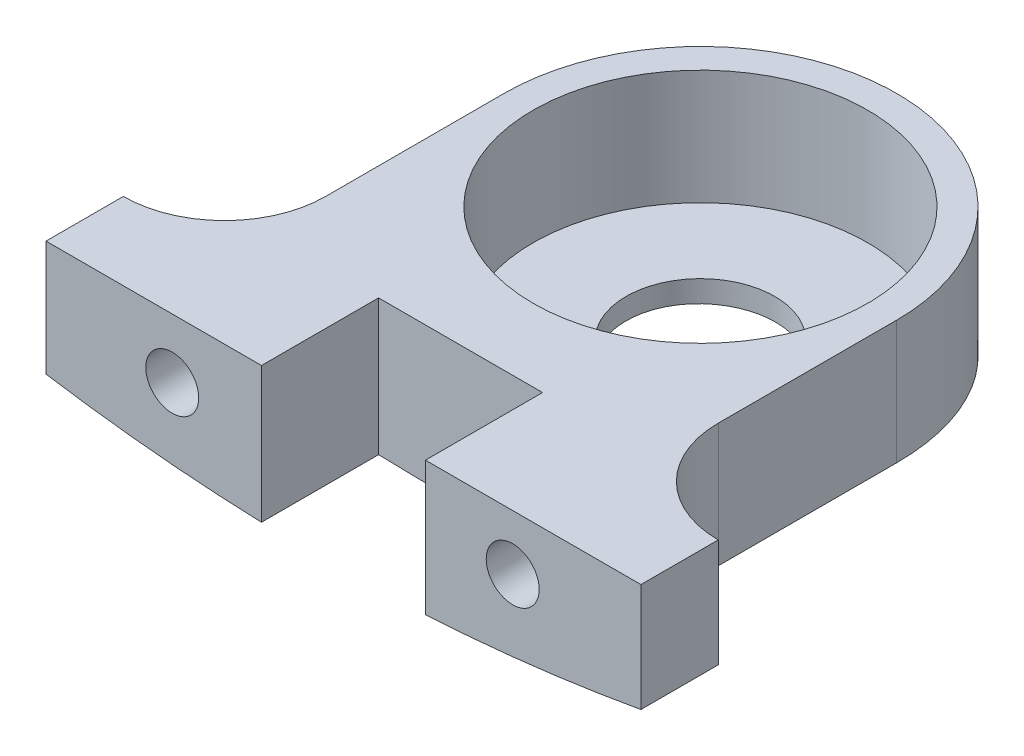
ISO-10303-21;
HEADER;
FILE_DESCRIPTION(('STEP AP214'),'2;1');
FILE_NAME('part.step','',(''),(''),'','','');
FILE_SCHEMA(('AUTOMOTIVE_DESIGN { 1 0 10303 214 1 1 1 1 }'));
ENDSEC;
DATA;
#1=APPLICATION_CONTEXT('core data for automotive mechanical design processes');
#2=APPLICATION_PROTOCOL_DEFINITION('international standard','automotive_design',2000,#1);
#3=PRODUCT_CONTEXT('',#1,'mechanical');
#4=PRODUCT('Part','Part','',(#3));
#5=PRODUCT_RELATED_PRODUCT_CATEGORY('part','',(#4));
#6=PRODUCT_DEFINITION_FORMATION('','',#4);
#7=PRODUCT_DEFINITION_CONTEXT('part definition',#1,'design');
#8=PRODUCT_DEFINITION('design','',#6,#7);
#9=PRODUCT_DEFINITION_SHAPE('','',#8);
#10=(LENGTH_UNIT() NAMED_UNIT(*) SI_UNIT(.MILLI.,.METRE.));
#11=(NAMED_UNIT(*) PLANE_ANGLE_UNIT() SI_UNIT($,.RADIAN.));
#12=(NAMED_UNIT(*) SI_UNIT($,.STERADIAN.) SOLID_ANGLE_UNIT());
#13=UNCERTAINTY_MEASURE_WITH_UNIT(LENGTH_MEASURE(1.E-05),#10,'distance_accuracy_value','');
#14=(GEOMETRIC_REPRESENTATION_CONTEXT(3) GLOBAL_UNCERTAINTY_ASSIGNED_CONTEXT((#13)) GLOBAL_UNIT_ASSIGNED_CONTEXT((#10,
#11,#12)) REPRESENTATION_CONTEXT('',''));
#15=CARTESIAN_POINT('',(0.,0.,0.));
#16=DIRECTION('',(0.,0.,1.));
#17=DIRECTION('',(1.,0.,0.));
#18=AXIS2_PLACEMENT_3D('',#15,#16,#17);
#19=CARTESIAN_POINT('',(0.,5.842,0.));
#20=DIRECTION('',(0.,0.,-1.));
#21=DIRECTION('',(-1.,0.,0.));
#22=AXIS2_PLACEMENT_3D('',#19,#20,#21);
#23=PLANE('',#22);
#24=CARTESIAN_POINT('',(5.390000015,3.302,0.));
#25=DIRECTION('',(0.,0.,1.));
#26=DIRECTION('',(1.,0.,0.));
#27=AXIS2_PLACEMENT_3D('',#24,#25,#26);
#28=CIRCLE('',#27,1.1303);
#29=CARTESIAN_POINT('',(6.520300015,3.302,0.));
#30=VERTEX_POINT('',#29);
#31=EDGE_CURVE('E392',#30,#30,#28,.T.);
#32=ORIENTED_EDGE('',*,*,#31,.F.);
#33=EDGE_LOOP('',(#32));
#34=FACE_BOUND('',#33,.T.);
#35=CARTESIAN_POINT('',(11.811,76.2,0.));
#36=DIRECTION('',(0.,0.,1.));
#37=DIRECTION('',(1.,0.,0.));
#38=AXIS2_PLACEMENT_3D('',#35,#36,#37);
#39=CIRCLE('',#38,76.2);
#40=CARTESIAN_POINT('',(0.,0.920917387364509,0.));
#41=VERTEX_POINT('',#40);
#42=CARTESIAN_POINT('',(9.200000015,0.0447462148649436,0.));
#43=VERTEX_POINT('',#42);
#44=EDGE_CURVE('E171',#41,#43,#39,.T.);
#45=ORIENTED_EDGE('',*,*,#44,.T.);
#46=DIRECTION('',(0.,1.,0.));
#47=VECTOR('',#46,1.);
#48=CARTESIAN_POINT('',(9.200000015,0.,0.));
#49=LINE('',#48,#47);
#50=CARTESIAN_POINT('',(9.200000015,5.842,0.));
#51=VERTEX_POINT('',#50);
#52=EDGE_CURVE('E154',#43,#51,#49,.T.);
#53=ORIENTED_EDGE('',*,*,#52,.T.);
#54=DIRECTION('',(1.,0.,0.));
#55=VECTOR('',#54,1.);
#56=CARTESIAN_POINT('',(0.,5.842,0.));
#57=LINE('',#56,#55);
#58=CARTESIAN_POINT('',(0.,5.842,0.));
#59=VERTEX_POINT('',#58);
#60=EDGE_CURVE('E169',#59,#51,#57,.T.);
#61=ORIENTED_EDGE('',*,*,#60,.F.);
#62=DIRECTION('',(0.,-1.,0.));
#63=VECTOR('',#62,1.);
#64=CARTESIAN_POINT('',(0.,5.842,0.));
#65=LINE('',#64,#63);
#66=EDGE_CURVE('E190',#59,#41,#65,.T.);
#67=ORIENTED_EDGE('',*,*,#66,.T.);
#68=EDGE_LOOP('',(#45,#53,#61,#67));
#69=FACE_BOUND('',#68,.T.);
#70=ADVANCED_FACE('F63',(#34,#69),#23,.F.);
#71=CARTESIAN_POINT('',(12.7,0.,-15.24));
#72=DIRECTION('',(0.,1.,0.));
#73=DIRECTION('',(0.,0.,1.));
#74=AXIS2_PLACEMENT_3D('',#71,#72,#73);
#75=CYLINDRICAL_SURFACE('',#74,3.175);
#76=CARTESIAN_POINT('',(12.7,0.9398,-15.24));
#77=DIRECTION('',(0.,1.,0.));
#78=DIRECTION('',(0.,0.,1.));
#79=AXIS2_PLACEMENT_3D('',#76,#77,#78);
#80=CIRCLE('',#79,3.175);
#81=CARTESIAN_POINT('',(12.7,0.9398,-12.065));
#82=VERTEX_POINT('',#81);
#83=EDGE_CURVE('E193',#82,#82,#80,.F.);
#84=ORIENTED_EDGE('',*,*,#83,.F.);
#85=EDGE_LOOP('',(#84));
#86=FACE_BOUND('',#85,.T.);
#87=CARTESIAN_POINT('',(11.811,0.,-18.288));
#88=CARTESIAN_POINT('',(11.639659984955,-1.33020330484414E-07,-18.2380258069107));
#89=CARTESIAN_POINT('',(11.4725436808237,0.000582784709653354,-18.1735694069715));
#90=CARTESIAN_POINT('',(11.1515045205025,0.00268466430180102,-18.017524324657));
#91=CARTESIAN_POINT('',(10.9975817708532,0.00420363372195491,-17.9259354232079));
#92=CARTESIAN_POINT('',(10.7073005094617,0.00785504660870994,-17.7182300502918));
#93=CARTESIAN_POINT('',(10.5709415435385,0.00998747420731721,-17.6021142132704));
#94=CARTESIAN_POINT('',(10.3196471262968,0.0144915515595443,-17.3486474058928));
#95=CARTESIAN_POINT('',(10.2047116686422,0.0168632012424116,-17.2112964418172));
#96=CARTESIAN_POINT('',(9.99948257465703,0.0214664093906249,-16.9191970238617));
#97=CARTESIAN_POINT('',(9.90919815358528,0.0236979152268404,-16.7644420943244));
#98=CARTESIAN_POINT('',(9.75589103243003,0.0276793248309426,-16.4419654239387));
#99=CARTESIAN_POINT('',(9.69286834897078,0.0294292283051472,-16.2742436751832));
#100=CARTESIAN_POINT('',(9.59588152829753,0.0321877444029808,-15.9306105035032));
#101=CARTESIAN_POINT('',(9.56191455798182,0.0331964292983974,-15.7546998808058));
#102=CARTESIAN_POINT('',(9.52399600497441,0.0343254425543746,-15.3996698849849));
#103=CARTESIAN_POINT('',(9.52004440144702,0.0344457715316032,-15.2205505140891));
#104=CARTESIAN_POINT('',(9.54226473207113,0.0337807233790837,-14.8642603093596));
#105=CARTESIAN_POINT('',(9.56842526119745,0.0329956891570814,-14.687088763435));
#106=CARTESIAN_POINT('',(9.6501055117808,0.0306348554942418,-14.3396603306782));
#107=CARTESIAN_POINT('',(9.70562413703261,0.029059085578885,-14.169403185924));
#108=CARTESIAN_POINT('',(9.84444010554728,0.0253491200150155,-13.8406268478551));
#109=CARTESIAN_POINT('',(9.92773724962378,0.0232149283706997,-13.6821075703839));
#110=CARTESIAN_POINT('',(10.1197766169972,0.0187099693643392,-13.3812578001234));
#111=CARTESIAN_POINT('',(10.2285251208648,0.0163391436916409,-13.2389313160947));
#112=CARTESIAN_POINT('',(10.4684575073065,0.0117334111774266,-12.9744391418341));
#113=CARTESIAN_POINT('',(10.5996609112935,0.00949862491456395,-12.8522911771513));
#114=CARTESIAN_POINT('',(10.8806251602909,0.00555112808064739,-12.6318762751439));
#115=CARTESIAN_POINT('',(11.030363844734,0.00383780237804544,-12.5335812281293));
#116=CARTESIAN_POINT('',(11.2862239850511,0.00174239189259228,-12.3949011161598));
#117=CARTESIAN_POINT('',(11.3880971980375,0.00110241373054494,-12.3465212823384));
#118=CARTESIAN_POINT('',(11.5964030074975,0.000230945059182641,-12.2608421085277));
#119=CARTESIAN_POINT('',(11.7028356044303,-5.45409004557044E-07,-12.2235427696539));
#120=CARTESIAN_POINT('',(11.9821016494661,8.62764336378542E-07,-12.1421035448117));
#121=CARTESIAN_POINT('',(12.157536782265,0.000582349386991219,-12.1066117647604));
#122=CARTESIAN_POINT('',(12.5120096053791,0.00301793360574082,-12.0655409285875));
#123=CARTESIAN_POINT('',(12.6910512994351,0.00487353087665019,-12.0599971906667));
#124=CARTESIAN_POINT('',(13.0474375237304,0.00982378188205822,-12.0790308540357));
#125=CARTESIAN_POINT('',(13.224782838651,0.0129178312460224,-12.103593575269));
#126=CARTESIAN_POINT('',(13.5727716448817,0.0201702301276907,-12.1821073146812));
#127=CARTESIAN_POINT('',(13.7434167260534,0.0243283253818394,-12.2360513154032));
#128=CARTESIAN_POINT('',(14.0733180294454,0.0334116140343461,-12.3718201838417));
#129=CARTESIAN_POINT('',(14.2325679502216,0.0383372271535053,-12.4536603359546));
#130=CARTESIAN_POINT('',(14.535077304713,0.0485565247861523,-12.6428960229309));
#131=CARTESIAN_POINT('',(14.6783360284313,0.0538502256255328,-12.7502926918218));
#132=CARTESIAN_POINT('',(14.9449267883802,0.0643555746529418,-12.9877086572589));
#133=CARTESIAN_POINT('',(15.0682407214338,0.069567144464644,-13.117748286203));
#134=CARTESIAN_POINT('',(15.2912874442229,0.079437081313316,-13.396702524333));
#135=CARTESIAN_POINT('',(15.391020279945,0.0840954494291022,-13.5456170967091));
#136=CARTESIAN_POINT('',(15.5640592150125,0.0924308511637478,-13.8580877605781));
#137=CARTESIAN_POINT('',(15.637367955143,0.0961079828363858,-14.0216423869252));
#138=CARTESIAN_POINT('',(15.7554778418362,0.102137902287413,-14.3587625917334));
#139=CARTESIAN_POINT('',(15.8002792657872,0.104490702952075,-14.5323280727668));
#140=CARTESIAN_POINT('',(15.8600550613065,0.107647819146207,-14.884321487261));
#141=CARTESIAN_POINT('',(15.8750650051274,0.108453981387101,-15.0627433634955));
#142=CARTESIAN_POINT('',(15.8749345714229,0.108447013058018,-15.4195756476724));
#143=CARTESIAN_POINT('',(15.8597943249342,0.107633889525673,-15.5979860556614));
#144=CARTESIAN_POINT('',(15.7998211859722,0.104466667319048,-15.9495876766059));
#145=CARTESIAN_POINT('',(15.7550111509592,0.102113754906836,-16.1227828000906));
#146=CARTESIAN_POINT('',(15.6370011068179,0.0960895751541482,-16.4591898692493));
#147=CARTESIAN_POINT('',(15.5638009914253,0.0924183028790484,-16.6224017775535));
#148=CARTESIAN_POINT('',(15.391033903657,0.0840962148865524,-16.9343350170851));
#149=CARTESIAN_POINT('',(15.2914488798053,0.079444728994602,-17.0830463319446));
#150=CARTESIAN_POINT('',(15.0687600818987,0.069589625409996,-17.3616512676511));
#151=CARTESIAN_POINT('',(14.9456561227703,0.0643860033726521,-17.4915447404037));
#152=CARTESIAN_POINT('',(14.6792476870334,0.0538844760347486,-17.7289919216759));
#153=CARTESIAN_POINT('',(14.5359187264652,0.0485864633612083,-17.8365181566684));
#154=CARTESIAN_POINT('',(14.2332315855067,0.0383581419059909,-18.0259836942686));
#155=CARTESIAN_POINT('',(14.0738733695013,0.0334278339413563,-18.1079229400232));
#156=CARTESIAN_POINT('',(13.7436081709901,0.0243326701342399,-18.2438981576036));
#157=CARTESIAN_POINT('',(13.5726988997707,0.0201679665994959,-18.2979285811679));
#158=CARTESIAN_POINT('',(13.2242121143629,0.0129066852294593,-18.3765156730495));
#159=CARTESIAN_POINT('',(13.0466346710745,0.00981009604089902,-18.4010726546546));
#160=CARTESIAN_POINT('',(12.6902814769103,0.00486538129947752,-18.4199830684824));
#161=CARTESIAN_POINT('',(12.5115095257409,0.00301433712999111,-18.4144073880049));
#162=CARTESIAN_POINT('',(12.1574210199326,0.000581714374151783,-18.3733685633865));
#163=CARTESIAN_POINT('',(11.9821044572641,1.32837482236829E-07,-18.3379054887062));
#164=CARTESIAN_POINT('',(11.811,0.,-18.288));
#165=B_SPLINE_CURVE_WITH_KNOTS('',3,(#87,#88,#89,#90,#91,#92,#93,#94,#95,#96,#97,#98,#99,#100,
#101,#102,#103,#104,#105,#106,#107,#108,#109,#110,#111,#112,#113,#114,#115,#116,#117,#118,#119,
#120,#121,#122,#123,#124,#125,#126,#127,#128,#129,#130,#131,#132,#133,#134,#135,#136,#137,#138,
#139,#140,#141,#142,#143,#144,#145,#146,#147,#148,#149,#150,#151,#152,#153,#154,#155,#156,#157,
#158,#159,#160,#161,#162,#163,#164),.UNSPECIFIED.,.T.,.F.,(4,2,2,2,2,2,2,2,2,2,2,2,2,2,2,2,2,2,
2,2,2,2,2,2,2,2,2,2,2,2,2,2,2,2,2,2,2,2,4),(0.,0.534805626423452,1.0696155711005,
1.60441168337902,2.13920763748625,2.67420324065991,3.20919917007418,3.74414292831305,
4.27908631521123,4.81382715797578,5.34854803540201,5.88326507868484,6.41811421218935,
6.95343070675916,7.48811325527528,7.82586275326964,8.16361228526964,8.69788700411056,
9.23279166426802,9.76743560603119,10.3019519088131,10.8367615469085,11.3715949207076,
11.9069110520126,12.4422261393633,12.9774877132715,13.5127440787793,14.0473609407554,
14.5819754792208,15.1161786317228,15.6503837837694,16.1849553651592,16.7195311533359,
17.2547597299094,17.7899894957293,18.3253256240793,18.8606560620257,19.3947276803663,
19.9287980574871),.UNSPECIFIED.);
#166=CARTESIAN_POINT('',(11.811,0.,-18.288));
#167=VERTEX_POINT('',#166);
#168=EDGE_CURVE('E233',#167,#167,#165,.T.);
#169=ORIENTED_EDGE('',*,*,#168,.F.);
#170=EDGE_LOOP('',(#169));
#171=FACE_BOUND('',#170,.T.);
#172=ADVANCED_FACE('F259',(#86,#171),#75,.F.);
#173=CARTESIAN_POINT('',(19.9258568558448,3.48724958219015,0.));
#174=DIRECTION('',(0.,0.,1.));
#175=DIRECTION('',(-1.,0.,0.));
#176=AXIS2_PLACEMENT_3D('',#173,#174,#175);
#177=CIRCLE('',#176,1.1303);
#178=CARTESIAN_POINT('',(18.7955568558448,3.48724958219015,0.));
#179=VERTEX_POINT('',#178);
#180=EDGE_CURVE('E274',#179,#179,#177,.T.);
#181=ORIENTED_EDGE('',*,*,#180,.F.);
#182=EDGE_LOOP('',(#181));
#183=FACE_BOUND('',#182,.T.);
#184=CARTESIAN_POINT('',(16.200000015,5.842,0.));
#185=VERTEX_POINT('',#184);
#186=CARTESIAN_POINT('',(25.4,5.842,0.));
#187=VERTEX_POINT('',#186);
#188=EDGE_CURVE('E180',#185,#187,#57,.T.);
#189=ORIENTED_EDGE('',*,*,#188,.F.);
#190=DIRECTION('',(0.,1.,0.));
#191=VECTOR('',#190,1.);
#192=CARTESIAN_POINT('',(16.200000015,0.,0.));
#193=LINE('',#192,#191);
#194=CARTESIAN_POINT('',(16.200000015,0.126504754491996,0.));
#195=VERTEX_POINT('',#194);
#196=EDGE_CURVE('E172',#195,#185,#193,.T.);
#197=ORIENTED_EDGE('',*,*,#196,.F.);
#198=CARTESIAN_POINT('',(25.4,1.22147588142323,0.));
#199=VERTEX_POINT('',#198);
#200=EDGE_CURVE('E294',#195,#199,#39,.T.);
#201=ORIENTED_EDGE('',*,*,#200,.T.);
#202=DIRECTION('',(0.,-1.,0.));
#203=VECTOR('',#202,1.);
#204=CARTESIAN_POINT('',(25.4,5.842,0.));
#205=LINE('',#204,#203);
#206=EDGE_CURVE('E183',#187,#199,#205,.T.);
#207=ORIENTED_EDGE('',*,*,#206,.F.);
#208=EDGE_LOOP('',(#189,#197,#201,#207));
#209=FACE_BOUND('',#208,.T.);
#210=ADVANCED_FACE('F244',(#183,#209),#23,.F.);
#211=CARTESIAN_POINT('',(12.7,0.,-15.24));
#212=DIRECTION('',(0.,1.,0.));
#213=DIRECTION('',(0.,0.,1.));
#214=AXIS2_PLACEMENT_3D('',#211,#212,#213);
#215=CYLINDRICAL_SURFACE('',#214,8.382);
#216=DIRECTION('',(0.,1.,0.));
#217=VECTOR('',#216,1.);
#218=CARTESIAN_POINT('',(21.082,0.,-15.24));
#219=LINE('',#218,#217);
#220=CARTESIAN_POINT('',(21.082,0.566088564718556,-15.24));
#221=VERTEX_POINT('',#220);
#222=CARTESIAN_POINT('',(21.082,5.842,-15.24));
#223=VERTEX_POINT('',#222);
#224=EDGE_CURVE('E341',#221,#223,#219,.T.);
#225=ORIENTED_EDGE('',*,*,#224,.F.);
#226=CARTESIAN_POINT('',(21.082,0.566088564718556,-15.24));
#227=CARTESIAN_POINT('',(21.0820263058052,0.566100067666238,-15.4747887029446));
#228=CARTESIAN_POINT('',(21.0721361014276,0.564879731263794,-15.7095725206864));
#229=CARTESIAN_POINT('',(21.0327135207659,0.560058642797299,-16.177443867934));
#230=CARTESIAN_POINT('',(21.0031826038017,0.556458067586919,-16.4105315221653));
#231=CARTESIAN_POINT('',(20.9247086755802,0.546964493741107,-16.8731278451367));
#232=CARTESIAN_POINT('',(20.8757851183609,0.541073792595658,-17.102639861759));
#233=CARTESIAN_POINT('',(20.7588958527304,0.527160459911592,-17.5566937893149));
#234=CARTESIAN_POINT('',(20.6909302694616,0.519137842383745,-17.7812357329009));
#235=CARTESIAN_POINT('',(20.5364406918093,0.501170939433018,-18.2238004168814));
#236=CARTESIAN_POINT('',(20.4499138548274,0.491226359690717,-18.4418221528926));
#237=CARTESIAN_POINT('',(20.258900482068,0.469674409561355,-18.8698613589363));
#238=CARTESIAN_POINT('',(20.1544073162543,0.458066425599808,-19.0798758390064));
#239=CARTESIAN_POINT('',(19.9282656802866,0.433497358767446,-19.4902916302789));
#240=CARTESIAN_POINT('',(19.8066222314208,0.420536672230578,-19.69069573229));
#241=CARTESIAN_POINT('',(19.5470166414081,0.393594796485769,-20.0805721148191));
#242=CARTESIAN_POINT('',(19.4090541518485,0.379613585492006,-20.2700441618083));
#243=CARTESIAN_POINT('',(19.1171179493646,0.350924576115074,-20.6375779591886));
#244=CARTESIAN_POINT('',(18.9630743420993,0.336213765290174,-20.8155839596788));
#245=CARTESIAN_POINT('',(18.6405760704325,0.306501560324867,-21.1580061064741));
#246=CARTESIAN_POINT('',(18.4721210220939,0.29150015845103,-21.322421890491));
#247=CARTESIAN_POINT('',(18.1219825771435,0.26158835431106,-21.6365099792514));
#248=CARTESIAN_POINT('',(17.9402993956972,0.246677950569047,-21.7861825237117));
#249=CARTESIAN_POINT('',(17.5649031847573,0.217317440803927,-22.0697876023989));
#250=CARTESIAN_POINT('',(17.3711860196069,0.202867495634334,-22.2037146792125));
#251=CARTESIAN_POINT('',(16.9724196145921,0.174742136785004,-22.4552702970739));
#252=CARTESIAN_POINT('',(16.7673324873607,0.161069663594421,-22.5728391175199));
#253=CARTESIAN_POINT('',(16.3479000075055,0.134891807505808,-22.7902682042113));
#254=CARTESIAN_POINT('',(16.1335544940412,0.122386444895256,-22.8901281626568));
#255=CARTESIAN_POINT('',(15.6971589359485,0.0988468893636747,-23.0713969812919));
#256=CARTESIAN_POINT('',(15.4751100859635,0.0878124696008702,-23.1528086878411));
#257=CARTESIAN_POINT('',(15.0248535399748,0.0674713121985227,-23.2966016648958));
#258=CARTESIAN_POINT('',(14.7966458261651,0.058164579554535,-23.3589828803755));
#259=CARTESIAN_POINT('',(14.3410155385146,0.0416794528068576,-23.4630369765526));
#260=CARTESIAN_POINT('',(14.1136957198279,0.034457014166213,-23.505153317289));
#261=CARTESIAN_POINT('',(13.6563017091499,0.0220031906409708,-23.570472859107));
#262=CARTESIAN_POINT('',(13.4262275495711,0.0167717823501695,-23.5936762825292));
#263=CARTESIAN_POINT('',(12.9649092202769,0.00838816342466078,-23.6209986143273));
#264=CARTESIAN_POINT('',(12.7336650421773,0.00523596771075743,-23.6251173857496));
#265=CARTESIAN_POINT('',(12.2716097549251,0.00104188194711074,-23.6142348694598));
#266=CARTESIAN_POINT('',(12.0407986438003,-1.77363193689054E-08,-23.5992336690324));
#267=CARTESIAN_POINT('',(11.5773215628072,1.80357975798893E-08,-23.5497979635059));
#268=CARTESIAN_POINT('',(11.3446900694219,0.00107743280735119,-23.5150396333272));
#269=CARTESIAN_POINT('',(10.8831917284888,0.00529922802862396,-23.4261074139461));
#270=CARTESIAN_POINT('',(10.6543248377899,0.00844358476947923,-23.3719337474507));
#271=CARTESIAN_POINT('',(10.2019276037295,0.016654805823008,-23.2445483390511));
#272=CARTESIAN_POINT('',(9.97839857086911,0.0217221371919518,-23.1713319733749));
#273=CARTESIAN_POINT('',(9.53839824789873,0.0335788843295557,-23.0064263485847));
#274=CARTESIAN_POINT('',(9.32192453991092,0.0403677029857307,-22.9147434969915));
#275=CARTESIAN_POINT('',(8.89748659436005,0.0554234466098431,-22.7135514414295));
#276=CARTESIAN_POINT('',(8.68952215503927,0.0636903365072111,-22.6040426604265));
#277=CARTESIAN_POINT('',(8.28356230582336,0.0814183721008371,-22.3679824049762));
#278=CARTESIAN_POINT('',(8.08556667978855,0.0908794918886874,-22.2414313002522));
#279=CARTESIAN_POINT('',(7.70092687021768,0.110681492407803,-21.9721840189543));
#280=CARTESIAN_POINT('',(7.51428252915107,0.121022360925336,-21.8294880665135));
#281=CARTESIAN_POINT('',(7.15364642646395,0.142247650103028,-21.5289569909565));
#282=CARTESIAN_POINT('',(6.97965450938053,0.153132064081761,-21.3711220539114));
#283=CARTESIAN_POINT('',(6.64493798282821,0.175135376792775,-21.0408297864461));
#284=CARTESIAN_POINT('',(6.48426279931456,0.186254972229576,-20.8683224106588));
#285=CARTESIAN_POINT('',(6.17805625805771,0.208332645065771,-20.5104472543179));
#286=CARTESIAN_POINT('',(6.03251971922792,0.219290776615554,-20.3250839100629));
#287=CARTESIAN_POINT('',(5.75748792770342,0.240708048671227,-19.9426535282725));
#288=CARTESIAN_POINT('',(5.6280003619961,0.251166948596452,-19.7455809486977));
#289=CARTESIAN_POINT('',(5.38607074330337,0.271250344187324,-19.3412039235228));
#290=CARTESIAN_POINT('',(5.27362819059503,0.28087486431164,-19.1338997781265));
#291=CARTESIAN_POINT('',(5.06640886760331,0.299003081763044,-18.7101488609645));
#292=CARTESIAN_POINT('',(4.9716630358459,0.307504808692184,-18.4936868741408));
#293=CARTESIAN_POINT('',(4.80076625048308,0.323099755140285,-18.0534977768605));
#294=CARTESIAN_POINT('',(4.72461485097727,0.33019300843413,-17.8297708407655));
#295=CARTESIAN_POINT('',(4.59153974770292,0.342740232371341,-17.3769207267459));
#296=CARTESIAN_POINT('',(4.53459314667036,0.348196154291027,-17.1478043258225));
#297=CARTESIAN_POINT('',(4.44024011226366,0.357306560988338,-16.6856407015562));
#298=CARTESIAN_POINT('',(4.40282447227246,0.360961894491853,-16.452595383827));
#299=CARTESIAN_POINT('',(4.3562042144541,0.365532984157617,-16.0559448153203));
#300=CARTESIAN_POINT('',(4.34186920042574,0.366944900703798,-15.8929299323694));
#301=CARTESIAN_POINT('',(4.32277339316055,0.368829060226534,-15.5666151214052));
#302=CARTESIAN_POINT('',(4.31799625101577,0.369302907771964,-15.4033161591638));
#303=CARTESIAN_POINT('',(4.318,0.369300735124452,-15.24));
#304=B_SPLINE_CURVE_WITH_KNOTS('',3,(#226,#227,#228,#229,#230,#231,#232,#233,#234,#235,#236,
#237,#238,#239,#240,#241,#242,#243,#244,#245,#246,#247,#248,#249,#250,#251,#252,#253,#254,#255,
#256,#257,#258,#259,#260,#261,#262,#263,#264,#265,#266,#267,#268,#269,#270,#271,#272,#273,#274,
#275,#276,#277,#278,#279,#280,#281,#282,#283,#284,#285,#286,#287,#288,#289,#290,#291,#292,#293,
#294,#295,#296,#297,#298,#299,#300,#301,#302,#303),.UNSPECIFIED.,.F.,.F.,(4,2,2,2,2,2,2,2,2,2,2,
2,2,2,2,2,2,2,2,2,2,2,2,2,2,2,2,2,2,2,2,2,2,2,2,2,2,2,4),(0.,0.704147599851042,1.40824288684472,
2.11163362969969,2.81501975004654,3.51851366879976,4.22226775424248,4.92581621964001,
5.62937970855434,6.33613961703468,7.04291836025815,7.74968560975862,8.45669710860837,
9.166225587915,9.87576639841245,10.5851976600176,11.29463097289,11.9877406380536,
12.6808421548898,13.3739486454933,14.0670519719976,14.771857272291,15.4766544882542,
16.181622996578,16.8863473142669,17.5910549130027,18.2957472259757,19.0004297571573,
19.7051036282985,20.4122856155352,21.1192247732129,21.8265012361219,22.5337569592021,
23.2422378091301,23.9507016677929,24.6583178366024,25.3656001433152,25.8562841288362,
26.3461280707371),.UNSPECIFIED.);
#305=CARTESIAN_POINT('',(4.318,0.36930073512445,-15.24));
#306=VERTEX_POINT('',#305);
#307=EDGE_CURVE('E226',#221,#306,#304,.T.);
#308=ORIENTED_EDGE('',*,*,#307,.T.);
#309=DIRECTION('',(0.,1.,0.));
#310=VECTOR('',#309,1.);
#311=CARTESIAN_POINT('',(4.318,0.,-15.24));
#312=LINE('',#311,#310);
#313=CARTESIAN_POINT('',(4.318,5.842,-15.24));
#314=VERTEX_POINT('',#313);
#315=EDGE_CURVE('E301',#306,#314,#312,.T.);
#316=ORIENTED_EDGE('',*,*,#315,.T.);
#317=CARTESIAN_POINT('',(12.7,5.842,-15.24));
#318=DIRECTION('',(0.,1.,0.));
#319=DIRECTION('',(0.,0.,1.));
#320=AXIS2_PLACEMENT_3D('',#317,#318,#319);
#321=CIRCLE('',#320,8.382);
#322=EDGE_CURVE('E308',#223,#314,#321,.T.);
#323=ORIENTED_EDGE('',*,*,#322,.F.);
#324=EDGE_LOOP('',(#225,#308,#316,#323));
#325=FACE_BOUND('',#324,.T.);
#326=ADVANCED_FACE('F240',(#325),#215,.T.);
#327=CARTESIAN_POINT('',(25.4,5.842,0.));
#328=DIRECTION('',(-1.,0.,0.));
#329=DIRECTION('',(0.,0.,1.));
#330=AXIS2_PLACEMENT_3D('',#327,#328,#329);
#331=PLANE('',#330);
#332=DIRECTION('',(0.,0.,1.));
#333=VECTOR('',#332,1.);
#334=CARTESIAN_POINT('',(25.4,1.22147588142323,-23.622));
#335=LINE('',#334,#333);
#336=CARTESIAN_POINT('',(25.4,1.22147588142323,-3.302));
#337=VERTEX_POINT('',#336);
#338=EDGE_CURVE('E287',#337,#199,#335,.T.);
#339=ORIENTED_EDGE('',*,*,#338,.F.);
#340=DIRECTION('',(0.,1.,0.));
#341=VECTOR('',#340,1.);
#342=CARTESIAN_POINT('',(25.4,0.,-3.302));
#343=LINE('',#342,#341);
#344=CARTESIAN_POINT('',(25.4,5.842,-3.302));
#345=VERTEX_POINT('',#344);
#346=EDGE_CURVE('E334',#337,#345,#343,.T.);
#347=ORIENTED_EDGE('',*,*,#346,.T.);
#348=DIRECTION('',(0.,0.,-1.));
#349=VECTOR('',#348,1.);
#350=CARTESIAN_POINT('',(25.4,5.842,0.));
#351=LINE('',#350,#349);
#352=EDGE_CURVE('E179',#187,#345,#351,.T.);
#353=ORIENTED_EDGE('',*,*,#352,.F.);
#354=ORIENTED_EDGE('',*,*,#206,.T.);
#355=EDGE_LOOP('',(#339,#347,#353,#354));
#356=FACE_BOUND('',#355,.T.);
#357=ADVANCED_FACE('F243',(#356),#331,.F.);
#358=CARTESIAN_POINT('',(21.082,0.,0.));
#359=DIRECTION('',(-1.,0.,0.));
#360=DIRECTION('',(0.,0.,1.));
#361=AXIS2_PLACEMENT_3D('',#358,#359,#360);
#362=PLANE('',#361);
#363=DIRECTION('',(0.,0.,1.));
#364=VECTOR('',#363,1.);
#365=CARTESIAN_POINT('',(21.082,0.566088564718556,-23.622));
#366=LINE('',#365,#364);
#367=CARTESIAN_POINT('',(21.082,0.566088564718556,-7.62));
#368=VERTEX_POINT('',#367);
#369=EDGE_CURVE('E292',#221,#368,#366,.T.);
#370=ORIENTED_EDGE('',*,*,#369,.F.);
#371=ORIENTED_EDGE('',*,*,#224,.T.);
#372=DIRECTION('',(0.,0.,1.));
#373=VECTOR('',#372,1.);
#374=CARTESIAN_POINT('',(21.082,5.842,0.));
#375=LINE('',#374,#373);
#376=CARTESIAN_POINT('',(21.082,5.842,-7.62));
#377=VERTEX_POINT('',#376);
#378=EDGE_CURVE('E340',#223,#377,#375,.T.);
#379=ORIENTED_EDGE('',*,*,#378,.T.);
#380=DIRECTION('',(0.,1.,0.));
#381=VECTOR('',#380,1.);
#382=CARTESIAN_POINT('',(21.082,0.,-7.62));
#383=LINE('',#382,#381);
#384=EDGE_CURVE('E345',#368,#377,#383,.T.);
#385=ORIENTED_EDGE('',*,*,#384,.F.);
#386=EDGE_LOOP('',(#370,#371,#379,#385));
#387=FACE_BOUND('',#386,.T.);
#388=ADVANCED_FACE('F220',(#387),#362,.F.);
#389=CARTESIAN_POINT('',(25.4,0.,-7.62));
#390=DIRECTION('',(0.,1.,0.));
#391=DIRECTION('',(0.,0.,1.));
#392=AXIS2_PLACEMENT_3D('',#389,#390,#391);
#393=CYLINDRICAL_SURFACE('',#392,4.318);
#394=CARTESIAN_POINT('',(21.082,0.566088564718556,-7.62));
#395=CARTESIAN_POINT('',(21.0819864971909,0.566089090709348,-7.49930190746496));
#396=CARTESIAN_POINT('',(21.0870601158494,0.566708888246983,-7.37860586248132));
#397=CARTESIAN_POINT('',(21.1072839995968,0.569190829891533,-7.1380803741794));
#398=CARTESIAN_POINT('',(21.1224336955457,0.571052903829388,-7.01825088230093));
#399=CARTESIAN_POINT('',(21.1626939977832,0.576020960022279,-6.78041445920516));
#400=CARTESIAN_POINT('',(21.18779560977,0.579125819102321,-6.66240598197663));
#401=CARTESIAN_POINT('',(21.2477687658755,0.586586416884602,-6.42894032650408));
#402=CARTESIAN_POINT('',(21.2826402047215,0.590942142108393,-6.3134831207838));
#403=CARTESIAN_POINT('',(21.3619054405852,0.600914038946813,-6.08590774211381));
#404=CARTESIAN_POINT('',(21.4063016958631,0.606530535971424,-5.97379043968328));
#405=CARTESIAN_POINT('',(21.5042993293587,0.61903422284487,-5.75367773574233));
#406=CARTESIAN_POINT('',(21.5579041008164,0.625921881172889,-5.64568387166877));
#407=CARTESIAN_POINT('',(21.673879878376,0.640969991281274,-5.43467644847751));
#408=CARTESIAN_POINT('',(21.7362463630646,0.649129786822049,-5.33166035723826));
#409=CARTESIAN_POINT('',(21.869329334775,0.666732388158977,-5.13123225830394));
#410=CARTESIAN_POINT('',(21.9400488973156,0.676175666714655,-5.03382233449868));
#411=CARTESIAN_POINT('',(22.0894356678434,0.696361354755839,-4.84515007811102));
#412=CARTESIAN_POINT('',(22.1681172492573,0.707106120892686,-4.75389937773675));
#413=CARTESIAN_POINT('',(22.3327669397723,0.729877894981624,-4.57833996328671));
#414=CARTESIAN_POINT('',(22.4187377398163,0.741905376896959,-4.49403383576493));
#415=CARTESIAN_POINT('',(22.5973014350378,0.767223170276374,-4.33298766929694));
#416=CARTESIAN_POINT('',(22.6898930136738,0.780513230848517,-4.25624613331123));
#417=CARTESIAN_POINT('',(22.8810364028552,0.808331686083864,-4.11081294960832));
#418=CARTESIAN_POINT('',(22.9795903420708,0.822860523779695,-4.04212420290205));
#419=CARTESIAN_POINT('',(23.2845167513352,0.868461756348112,-3.84799011984797));
#420=CARTESIAN_POINT('',(23.4990492489423,0.901393956658199,-3.73547124654474));
#421=CARTESIAN_POINT('',(23.9431205318846,0.97166655479818,-3.54805515051175));
#422=CARTESIAN_POINT('',(24.1726541086365,1.00900542616113,-3.47314494713939));
#423=CARTESIAN_POINT('',(24.5694295583979,1.0755045902032,-3.3793203895132));
#424=CARTESIAN_POINT('',(24.7345126755353,1.10372249418093,-3.35032228819371));
#425=CARTESIAN_POINT('',(25.0664166063939,1.16159243710387,-3.31166199801129));
#426=CARTESIAN_POINT('',(25.2332343770004,1.19124221712595,-3.301970310283));
#427=CARTESIAN_POINT('',(25.4,1.22147588142323,-3.302));
#428=B_SPLINE_CURVE_WITH_KNOTS('',3,(#394,#395,#396,#397,#398,#399,#400,#401,#402,#403,#404,
#405,#406,#407,#408,#409,#410,#411,#412,#413,#414,#415,#416,#417,#418,#419,#420,#421,#422,#423,
#424,#425,#426,#427),.UNSPECIFIED.,.F.,.F.,(4,2,2,2,2,2,2,2,2,2,2,2,2,2,2,2,4),(0.,
0.361983178059039,0.723945911498063,1.08558225475868,1.44721470142831,1.80894059434481,
2.1708000664402,2.5324734850715,2.89428048575271,3.25675270242324,3.61935931961187,
3.98189403194261,4.34455894838146,5.07431552888258,5.80382006024423,6.31266624446505,
6.82073434872244),.UNSPECIFIED.);
#429=EDGE_CURVE('E203',#368,#337,#428,.T.);
#430=ORIENTED_EDGE('',*,*,#429,.F.);
#431=ORIENTED_EDGE('',*,*,#384,.T.);
#432=CARTESIAN_POINT('',(25.4,5.842,-7.62));
#433=DIRECTION('',(0.,1.,0.));
#434=DIRECTION('',(0.,0.,1.));
#435=AXIS2_PLACEMENT_3D('',#432,#433,#434);
#436=CIRCLE('',#435,4.318);
#437=EDGE_CURVE('E339',#377,#345,#436,.T.);
#438=ORIENTED_EDGE('',*,*,#437,.T.);
#439=ORIENTED_EDGE('',*,*,#346,.F.);
#440=EDGE_LOOP('',(#430,#431,#438,#439));
#441=FACE_BOUND('',#440,.T.);
#442=ADVANCED_FACE('F246',(#441),#393,.F.);
#443=CARTESIAN_POINT('',(0.,5.842,0.));
#444=DIRECTION('',(1.,0.,0.));
#445=DIRECTION('',(0.,0.,-1.));
#446=AXIS2_PLACEMENT_3D('',#443,#444,#445);
#447=PLANE('',#446);
#448=DIRECTION('',(0.,0.,1.));
#449=VECTOR('',#448,1.);
#450=CARTESIAN_POINT('',(0.,0.920917387364509,-23.622));
#451=LINE('',#450,#449);
#452=CARTESIAN_POINT('',(0.,0.920917387364509,-3.302));
#453=VERTEX_POINT('',#452);
#454=EDGE_CURVE('E86',#453,#41,#451,.T.);
#455=ORIENTED_EDGE('',*,*,#454,.T.);
#456=ORIENTED_EDGE('',*,*,#66,.F.);
#457=DIRECTION('',(0.,0.,1.));
#458=VECTOR('',#457,1.);
#459=CARTESIAN_POINT('',(0.,5.842,0.));
#460=LINE('',#459,#458);
#461=CARTESIAN_POINT('',(0.,5.842,-3.302));
#462=VERTEX_POINT('',#461);
#463=EDGE_CURVE('E178',#462,#59,#460,.T.);
#464=ORIENTED_EDGE('',*,*,#463,.F.);
#465=DIRECTION('',(0.,1.,0.));
#466=VECTOR('',#465,1.);
#467=CARTESIAN_POINT('',(0.,0.,-3.302));
#468=LINE('',#467,#466);
#469=EDGE_CURVE('E304',#453,#462,#468,.T.);
#470=ORIENTED_EDGE('',*,*,#469,.F.);
#471=EDGE_LOOP('',(#455,#456,#464,#470));
#472=FACE_BOUND('',#471,.T.);
#473=ADVANCED_FACE('F65',(#472),#447,.F.);
#474=CARTESIAN_POINT('',(4.318,0.,0.));
#475=DIRECTION('',(-1.,0.,0.));
#476=DIRECTION('',(0.,0.,1.));
#477=AXIS2_PLACEMENT_3D('',#474,#475,#476);
#478=PLANE('',#477);
#479=ORIENTED_EDGE('',*,*,#315,.F.);
#480=DIRECTION('',(0.,0.,1.));
#481=VECTOR('',#480,1.);
#482=CARTESIAN_POINT('',(4.318,0.36930073512445,-23.622));
#483=LINE('',#482,#481);
#484=CARTESIAN_POINT('',(4.318,0.36930073512445,-7.62));
#485=VERTEX_POINT('',#484);
#486=EDGE_CURVE('E234',#306,#485,#483,.T.);
#487=ORIENTED_EDGE('',*,*,#486,.T.);
#488=DIRECTION('',(0.,1.,0.));
#489=VECTOR('',#488,1.);
#490=CARTESIAN_POINT('',(4.318,0.,-7.62));
#491=LINE('',#490,#489);
#492=CARTESIAN_POINT('',(4.318,5.842,-7.62));
#493=VERTEX_POINT('',#492);
#494=EDGE_CURVE('E299',#485,#493,#491,.T.);
#495=ORIENTED_EDGE('',*,*,#494,.T.);
#496=DIRECTION('',(0.,0.,1.));
#497=VECTOR('',#496,1.);
#498=CARTESIAN_POINT('',(4.318,5.842,0.));
#499=LINE('',#498,#497);
#500=EDGE_CURVE('E350',#314,#493,#499,.T.);
#501=ORIENTED_EDGE('',*,*,#500,.F.);
#502=EDGE_LOOP('',(#479,#487,#495,#501));
#503=FACE_BOUND('',#502,.T.);
#504=ADVANCED_FACE('F248',(#503),#478,.T.);
#505=CARTESIAN_POINT('',(0.,0.,-7.62));
#506=DIRECTION('',(0.,1.,0.));
#507=DIRECTION('',(0.,0.,1.));
#508=AXIS2_PLACEMENT_3D('',#505,#506,#507);
#509=CYLINDRICAL_SURFACE('',#508,4.318);
#510=CARTESIAN_POINT('',(0.,0.920917387364509,-3.302));
#511=CARTESIAN_POINT('',(0.121721671950853,0.901816701726033,-3.30198747918755));
#512=CARTESIAN_POINT('',(0.243491165100046,0.883016947580258,-3.30714641938507));
#513=CARTESIAN_POINT('',(0.48626764164054,0.846132211428647,-3.32774183911912));
#514=CARTESIAN_POINT('',(0.607274619808265,0.828047234314896,-3.34317838898486));
#515=CARTESIAN_POINT('',(0.847623814236854,0.792711461029829,-3.38425639537327));
#516=CARTESIAN_POINT('',(0.966966602836699,0.77546037277279,-3.40989424921483));
#517=CARTESIAN_POINT('',(1.20317133801183,0.741877885740624,-3.47121842543983));
#518=CARTESIAN_POINT('',(1.32003335058777,0.725546462478804,-3.50690448013128));
#519=CARTESIAN_POINT('',(1.55050014750473,0.693869891712228,-3.58812569537369));
#520=CARTESIAN_POINT('',(1.66410298071128,0.678525328445255,-3.63366662180156));
#521=CARTESIAN_POINT('',(1.88718834533154,0.648887305984246,-3.73430530917921));
#522=CARTESIAN_POINT('',(1.99666933472634,0.634594238293426,-3.78940660435138));
#523=CARTESIAN_POINT('',(2.21058211376871,0.607119389234993,-3.90874141770328));
#524=CARTESIAN_POINT('',(2.31501733383332,0.593936848198277,-3.97296861106027));
#525=CARTESIAN_POINT('',(2.5181786838649,0.568697249991142,-4.11016669437267));
#526=CARTESIAN_POINT('',(2.61690271203898,0.556640606175484,-4.18314077332619));
#527=CARTESIAN_POINT('',(2.80709577456317,0.533767029468148,-4.33668531712529));
#528=CARTESIAN_POINT('',(2.89861646223373,0.522940963109617,-4.41719044596712));
#529=CARTESIAN_POINT('',(3.07462342748401,0.502420254255089,-4.5857508544697));
#530=CARTESIAN_POINT('',(3.15910707211721,0.492726034705386,-4.6738089353169));
#531=CARTESIAN_POINT('',(3.32035881025093,0.474471957174498,-4.85681124901275));
#532=CARTESIAN_POINT('',(3.39712811940607,0.465911920396499,-4.95175439281417));
#533=CARTESIAN_POINT('',(3.54241848473533,0.449911517499348,-5.14789650126445));
#534=CARTESIAN_POINT('',(3.61093661510928,0.442471548314399,-5.24909766581671));
#535=CARTESIAN_POINT('',(3.73870662176482,0.428750968445979,-5.45623133168658));
#536=CARTESIAN_POINT('',(3.79802304962794,0.422462219824418,-5.56212348045289));
#537=CARTESIAN_POINT('',(3.90755356553314,0.410960110038024,-5.77857080854146));
#538=CARTESIAN_POINT('',(3.95776766293331,0.405746747767586,-5.88912598306952));
#539=CARTESIAN_POINT('',(4.04869705200399,0.396380385377313,-6.11405169003997));
#540=CARTESIAN_POINT('',(4.08941748554419,0.392226811149342,-6.22842011863608));
#541=CARTESIAN_POINT('',(4.16108684653863,0.384961181753354,-6.46017355094193));
#542=CARTESIAN_POINT('',(4.19203802501123,0.3818488866453,-6.57755785298727));
#543=CARTESIAN_POINT('',(4.25121070531718,0.375922176031531,-6.84772895060917));
#544=CARTESIAN_POINT('',(4.27624521982163,0.373434774594112,-7.0012314006519));
#545=CARTESIAN_POINT('',(4.30964842933854,0.370126171518596,-7.30983049001923));
#546=CARTESIAN_POINT('',(4.3180411882948,0.369302564005502,-7.46492450103404));
#547=CARTESIAN_POINT('',(4.318,0.369300735124446,-7.62));
#548=B_SPLINE_CURVE_WITH_KNOTS('',3,(#510,#511,#512,#513,#514,#515,#516,#517,#518,#519,#520,
#521,#522,#523,#524,#525,#526,#527,#528,#529,#530,#531,#532,#533,#534,#535,#536,#537,#538,#539,
#540,#541,#542,#543,#544,#545,#546,#547),.UNSPECIFIED.,.F.,.F.,(4,2,2,2,2,2,2,2,2,2,2,2,2,2,2,2,
2,2,4),(0.,0.369526319550419,0.739055167778251,1.10845362927517,1.47784225063681,1.847447580636,
2.21718983647069,2.58667707634923,2.95629943846792,3.32296926843399,3.68977567928277,
4.05652419642319,4.4234023790196,4.78757751451238,5.15175227559496,5.51572933513865,
5.87962246625916,6.34533501359991,6.81037364905014),.UNSPECIFIED.);
#549=EDGE_CURVE('E192',#453,#485,#548,.T.);
#550=ORIENTED_EDGE('',*,*,#549,.F.);
#551=ORIENTED_EDGE('',*,*,#469,.T.);
#552=CARTESIAN_POINT('',(0.,5.842,-7.62));
#553=DIRECTION('',(0.,1.,0.));
#554=DIRECTION('',(0.,0.,1.));
#555=AXIS2_PLACEMENT_3D('',#552,#553,#554);
#556=CIRCLE('',#555,4.318);
#557=EDGE_CURVE('E302',#462,#493,#556,.T.);
#558=ORIENTED_EDGE('',*,*,#557,.T.);
#559=ORIENTED_EDGE('',*,*,#494,.F.);
#560=EDGE_LOOP('',(#550,#551,#558,#559));
#561=FACE_BOUND('',#560,.T.);
#562=ADVANCED_FACE('F209',(#561),#509,.F.);
#563=CARTESIAN_POINT('',(0.,5.842,0.));
#564=DIRECTION('',(0.,-1.,0.));
#565=DIRECTION('',(0.,0.,-1.));
#566=AXIS2_PLACEMENT_3D('',#563,#564,#565);
#567=PLANE('',#566);
#568=CARTESIAN_POINT('',(12.7,5.842,-15.24));
#569=DIRECTION('',(0.,1.,0.));
#570=DIRECTION('',(0.,0.,1.));
#571=AXIS2_PLACEMENT_3D('',#568,#569,#570);
#572=CIRCLE('',#571,7.14375);
#573=CARTESIAN_POINT('',(12.7,5.842,-8.09625));
#574=VERTEX_POINT('',#573);
#575=EDGE_CURVE('E306',#574,#574,#572,.T.);
#576=ORIENTED_EDGE('',*,*,#575,.F.);
#577=EDGE_LOOP('',(#576));
#578=FACE_BOUND('',#577,.T.);
#579=ORIENTED_EDGE('',*,*,#60,.T.);
#580=DIRECTION('',(0.,0.,1.));
#581=VECTOR('',#580,1.);
#582=CARTESIAN_POINT('',(9.200000015,5.842,0.));
#583=LINE('',#582,#581);
#584=CARTESIAN_POINT('',(9.200000015,5.842,-5.));
#585=VERTEX_POINT('',#584);
#586=EDGE_CURVE('E151',#585,#51,#583,.T.);
#587=ORIENTED_EDGE('',*,*,#586,.F.);
#588=DIRECTION('',(-1.,0.,0.));
#589=VECTOR('',#588,1.);
#590=CARTESIAN_POINT('',(9.200000015,5.842,-5.));
#591=LINE('',#590,#589);
#592=CARTESIAN_POINT('',(16.200000015,5.842,-5.));
#593=VERTEX_POINT('',#592);
#594=EDGE_CURVE('E173',#593,#585,#591,.T.);
#595=ORIENTED_EDGE('',*,*,#594,.F.);
#596=DIRECTION('',(0.,0.,-1.));
#597=VECTOR('',#596,1.);
#598=CARTESIAN_POINT('',(16.200000015,5.842,0.));
#599=LINE('',#598,#597);
#600=EDGE_CURVE('E162',#185,#593,#599,.T.);
#601=ORIENTED_EDGE('',*,*,#600,.F.);
#602=ORIENTED_EDGE('',*,*,#188,.T.);
#603=ORIENTED_EDGE('',*,*,#352,.T.);
#604=ORIENTED_EDGE('',*,*,#437,.F.);
#605=ORIENTED_EDGE('',*,*,#378,.F.);
#606=ORIENTED_EDGE('',*,*,#322,.T.);
#607=ORIENTED_EDGE('',*,*,#500,.T.);
#608=ORIENTED_EDGE('',*,*,#557,.F.);
#609=ORIENTED_EDGE('',*,*,#463,.T.);
#610=EDGE_LOOP('',(#579,#587,#595,#601,#602,#603,#604,#605,#606,#607,#608,#609));
#611=FACE_BOUND('',#610,.T.);
#612=ADVANCED_FACE('F175',(#578,#611),#567,.F.);
#613=CARTESIAN_POINT('',(12.7,0.9398,-15.24));
#614=DIRECTION('',(0.,1.,0.));
#615=DIRECTION('',(0.,0.,1.));
#616=AXIS2_PLACEMENT_3D('',#613,#614,#615);
#617=PLANE('',#616);
#618=CARTESIAN_POINT('',(12.7,0.9398,-15.24));
#619=DIRECTION('',(0.,1.,0.));
#620=DIRECTION('',(0.,0.,1.));
#621=AXIS2_PLACEMENT_3D('',#618,#619,#620);
#622=CIRCLE('',#621,7.14375);
#623=CARTESIAN_POINT('',(12.7,0.9398,-8.09625));
#624=VERTEX_POINT('',#623);
#625=EDGE_CURVE('E196',#624,#624,#622,.T.);
#626=ORIENTED_EDGE('',*,*,#625,.T.);
#627=EDGE_LOOP('',(#626));
#628=FACE_BOUND('',#627,.T.);
#629=ORIENTED_EDGE('',*,*,#83,.T.);
#630=EDGE_LOOP('',(#629));
#631=FACE_BOUND('',#630,.T.);
#632=ADVANCED_FACE('F318',(#628,#631),#617,.T.);
#633=CARTESIAN_POINT('',(12.7,0.9398,-15.24));
#634=DIRECTION('',(0.,1.,0.));
#635=DIRECTION('',(0.,0.,1.));
#636=AXIS2_PLACEMENT_3D('',#633,#634,#635);
#637=CYLINDRICAL_SURFACE('',#636,7.14375);
#638=ORIENTED_EDGE('',*,*,#625,.F.);
#639=EDGE_LOOP('',(#638));
#640=FACE_BOUND('',#639,.T.);
#641=ORIENTED_EDGE('',*,*,#575,.T.);
#642=EDGE_LOOP('',(#641));
#643=FACE_BOUND('',#642,.T.);
#644=ADVANCED_FACE('F218',(#640,#643),#637,.F.);
#645=CARTESIAN_POINT('',(11.811,76.2,-23.622));
#646=DIRECTION('',(0.,0.,1.));
#647=DIRECTION('',(1.,0.,0.));
#648=AXIS2_PLACEMENT_3D('',#645,#646,#647);
#649=CYLINDRICAL_SURFACE('',#648,76.2);
#650=DIRECTION('',(0.,0.,1.));
#651=VECTOR('',#650,1.);
#652=CARTESIAN_POINT('',(9.200000015,0.0447462148649436,-23.622));
#653=LINE('',#652,#651);
#654=CARTESIAN_POINT('',(9.200000015,0.0447462148649436,-5.));
#655=VERTEX_POINT('',#654);
#656=EDGE_CURVE('E12',#43,#655,#653,.F.);
#657=ORIENTED_EDGE('',*,*,#656,.F.);
#658=ORIENTED_EDGE('',*,*,#44,.F.);
#659=ORIENTED_EDGE('',*,*,#454,.F.);
#660=ORIENTED_EDGE('',*,*,#549,.T.);
#661=ORIENTED_EDGE('',*,*,#486,.F.);
#662=ORIENTED_EDGE('',*,*,#307,.F.);
#663=ORIENTED_EDGE('',*,*,#369,.T.);
#664=ORIENTED_EDGE('',*,*,#429,.T.);
#665=ORIENTED_EDGE('',*,*,#338,.T.);
#666=ORIENTED_EDGE('',*,*,#200,.F.);
#667=DIRECTION('',(0.,0.,1.));
#668=VECTOR('',#667,1.);
#669=CARTESIAN_POINT('',(16.200000015,0.126504754491996,-23.622));
#670=LINE('',#669,#668);
#671=CARTESIAN_POINT('',(16.200000015,0.126504754491996,-5.));
#672=VERTEX_POINT('',#671);
#673=EDGE_CURVE('E71',#672,#195,#670,.T.);
#674=ORIENTED_EDGE('',*,*,#673,.F.);
#675=CARTESIAN_POINT('',(11.811,76.2,-5.));
#676=DIRECTION('',(0.,0.,-1.));
#677=DIRECTION('',(-1.,0.,0.));
#678=AXIS2_PLACEMENT_3D('',#675,#676,#677);
#679=CIRCLE('',#678,76.2);
#680=EDGE_CURVE('E360',#655,#672,#679,.F.);
#681=ORIENTED_EDGE('',*,*,#680,.F.);
#682=EDGE_LOOP('',(#657,#658,#659,#660,#661,#662,#663,#664,#665,#666,#674,#681));
#683=FACE_BOUND('',#682,.T.);
#684=ORIENTED_EDGE('',*,*,#168,.T.);
#685=EDGE_LOOP('',(#684));
#686=FACE_BOUND('',#685,.T.);
#687=ADVANCED_FACE('F213',(#683,#686),#649,.T.);
#688=CARTESIAN_POINT('',(9.200000015,0.,0.));
#689=DIRECTION('',(-1.,0.,0.));
#690=DIRECTION('',(0.,0.,1.));
#691=AXIS2_PLACEMENT_3D('',#688,#689,#690);
#692=PLANE('',#691);
#693=ORIENTED_EDGE('',*,*,#656,.T.);
#694=DIRECTION('',(0.,1.,0.));
#695=VECTOR('',#694,1.);
#696=CARTESIAN_POINT('',(9.200000015,0.,-5.));
#697=LINE('',#696,#695);
#698=EDGE_CURVE('E157',#655,#585,#697,.T.);
#699=ORIENTED_EDGE('',*,*,#698,.T.);
#700=ORIENTED_EDGE('',*,*,#586,.T.);
#701=ORIENTED_EDGE('',*,*,#52,.F.);
#702=EDGE_LOOP('',(#693,#699,#700,#701));
#703=FACE_BOUND('',#702,.T.);
#704=ADVANCED_FACE('F153',(#703),#692,.F.);
#705=CARTESIAN_POINT('',(9.200000015,0.,-5.));
#706=DIRECTION('',(0.,0.,-1.));
#707=DIRECTION('',(-1.,0.,0.));
#708=AXIS2_PLACEMENT_3D('',#705,#706,#707);
#709=PLANE('',#708);
#710=ORIENTED_EDGE('',*,*,#698,.F.);
#711=ORIENTED_EDGE('',*,*,#680,.T.);
#712=DIRECTION('',(0.,1.,0.));
#713=VECTOR('',#712,1.);
#714=CARTESIAN_POINT('',(16.200000015,0.,-5.));
#715=LINE('',#714,#713);
#716=EDGE_CURVE('E78',#672,#593,#715,.T.);
#717=ORIENTED_EDGE('',*,*,#716,.T.);
#718=ORIENTED_EDGE('',*,*,#594,.T.);
#719=EDGE_LOOP('',(#710,#711,#717,#718));
#720=FACE_BOUND('',#719,.T.);
#721=ADVANCED_FACE('F364',(#720),#709,.F.);
#722=CARTESIAN_POINT('',(16.200000015,0.,0.));
#723=DIRECTION('',(1.,0.,0.));
#724=DIRECTION('',(0.,0.,-1.));
#725=AXIS2_PLACEMENT_3D('',#722,#723,#724);
#726=PLANE('',#725);
#727=ORIENTED_EDGE('',*,*,#673,.T.);
#728=ORIENTED_EDGE('',*,*,#196,.T.);
#729=ORIENTED_EDGE('',*,*,#600,.T.);
#730=ORIENTED_EDGE('',*,*,#716,.F.);
#731=EDGE_LOOP('',(#727,#728,#729,#730));
#732=FACE_BOUND('',#731,.T.);
#733=ADVANCED_FACE('F363',(#732),#726,.F.);
#734=CARTESIAN_POINT('',(5.390000015,3.302,-6.35));
#735=DIRECTION('',(0.,0.,1.));
#736=DIRECTION('',(1.,0.,0.));
#737=AXIS2_PLACEMENT_3D('',#734,#735,#736);
#738=CYLINDRICAL_SURFACE('',#737,1.1303);
#739=CARTESIAN_POINT('',(5.390000015,3.302,-6.35));
#740=DIRECTION('',(0.,0.,1.));
#741=DIRECTION('',(1.,0.,0.));
#742=AXIS2_PLACEMENT_3D('',#739,#740,#741);
#743=CIRCLE('',#742,1.1303);
#744=CARTESIAN_POINT('',(6.520300015,3.302,-6.35));
#745=VERTEX_POINT('',#744);
#746=EDGE_CURVE('E163',#745,#745,#743,.T.);
#747=ORIENTED_EDGE('',*,*,#746,.F.);
#748=EDGE_LOOP('',(#747));
#749=FACE_BOUND('',#748,.T.);
#750=ORIENTED_EDGE('',*,*,#31,.T.);
#751=EDGE_LOOP('',(#750));
#752=FACE_BOUND('',#751,.T.);
#753=ADVANCED_FACE('F371',(#749,#752),#738,.F.);
#754=CARTESIAN_POINT('',(5.390000015,3.302,-6.35));
#755=DIRECTION('',(0.,0.,1.));
#756=DIRECTION('',(1.,0.,0.));
#757=AXIS2_PLACEMENT_3D('',#754,#755,#756);
#758=PLANE('',#757);
#759=ORIENTED_EDGE('',*,*,#746,.T.);
#760=EDGE_LOOP('',(#759));
#761=FACE_BOUND('',#760,.T.);
#762=ADVANCED_FACE('F375',(#761),#758,.T.);
#763=CARTESIAN_POINT('',(19.9258568558448,3.48724958219015,-6.35));
#764=DIRECTION('',(0.,0.,1.));
#765=DIRECTION('',(1.,0.,0.));
#766=AXIS2_PLACEMENT_3D('',#763,#764,#765);
#767=CYLINDRICAL_SURFACE('',#766,1.1303);
#768=CARTESIAN_POINT('',(19.9258568558448,3.48724958219015,-6.35));
#769=DIRECTION('',(0.,0.,1.));
#770=DIRECTION('',(-1.,0.,0.));
#771=AXIS2_PLACEMENT_3D('',#768,#769,#770);
#772=CIRCLE('',#771,1.1303);
#773=CARTESIAN_POINT('',(18.7955568558448,3.48724958219015,-6.35));
#774=VERTEX_POINT('',#773);
#775=EDGE_CURVE('E391',#774,#774,#772,.T.);
#776=ORIENTED_EDGE('',*,*,#775,.F.);
#777=EDGE_LOOP('',(#776));
#778=FACE_BOUND('',#777,.T.);
#779=ORIENTED_EDGE('',*,*,#180,.T.);
#780=EDGE_LOOP('',(#779));
#781=FACE_BOUND('',#780,.T.);
#782=ADVANCED_FACE('F379',(#778,#781),#767,.F.);
#783=CARTESIAN_POINT('',(19.9258568558448,3.48724958219015,-6.35));
#784=DIRECTION('',(0.,0.,-1.));
#785=DIRECTION('',(-1.,0.,0.));
#786=AXIS2_PLACEMENT_3D('',#783,#784,#785);
#787=PLANE('',#786);
#788=ORIENTED_EDGE('',*,*,#775,.T.);
#789=EDGE_LOOP('',(#788));
#790=FACE_BOUND('',#789,.T.);
#791=ADVANCED_FACE('F383',(#790),#787,.F.);
#792=CLOSED_SHELL('',(#70,#172,#210,#326,#357,#388,#442,#473,#504,#562,#612,#632,#644,#687,#704,
#721,#733,#753,#762,#782,#791));
#793=MANIFOLD_SOLID_BREP('B2',#792);
#794=ADVANCED_BREP_SHAPE_REPRESENTATION('',(#18,#793),#14);
#795=SHAPE_DEFINITION_REPRESENTATION(#9,#794);
ENDSEC;
END-ISO-10303-21;
